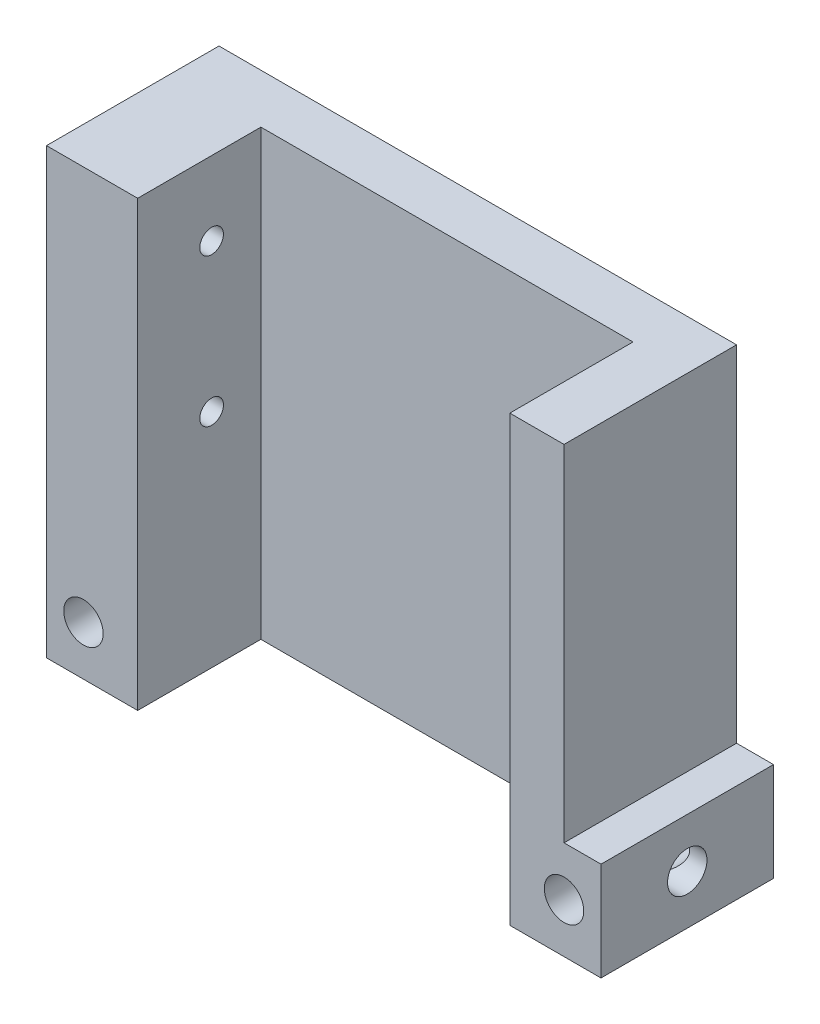
ISO-10303-21;
HEADER;
FILE_DESCRIPTION(('STEP AP214'),'2;1');
FILE_NAME('part.step','',(''),(''),'','','');
FILE_SCHEMA(('AUTOMOTIVE_DESIGN { 1 0 10303 214 1 1 1 1 }'));
ENDSEC;
DATA;
#1=APPLICATION_CONTEXT('core data for automotive mechanical design processes');
#2=APPLICATION_PROTOCOL_DEFINITION('international standard','automotive_design',2000,#1);
#3=PRODUCT_CONTEXT('',#1,'mechanical');
#4=PRODUCT('Part','Part','',(#3));
#5=PRODUCT_RELATED_PRODUCT_CATEGORY('part','',(#4));
#6=PRODUCT_DEFINITION_FORMATION('','',#4);
#7=PRODUCT_DEFINITION_CONTEXT('part definition',#1,'design');
#8=PRODUCT_DEFINITION('design','',#6,#7);
#9=PRODUCT_DEFINITION_SHAPE('','',#8);
#10=(LENGTH_UNIT() NAMED_UNIT(*) SI_UNIT(.MILLI.,.METRE.));
#11=(NAMED_UNIT(*) PLANE_ANGLE_UNIT() SI_UNIT($,.RADIAN.));
#12=(NAMED_UNIT(*) SI_UNIT($,.STERADIAN.) SOLID_ANGLE_UNIT());
#13=UNCERTAINTY_MEASURE_WITH_UNIT(LENGTH_MEASURE(1.E-05),#10,'distance_accuracy_value','');
#14=(GEOMETRIC_REPRESENTATION_CONTEXT(3) GLOBAL_UNCERTAINTY_ASSIGNED_CONTEXT((#13)) GLOBAL_UNIT_ASSIGNED_CONTEXT((#10,
#11,#12)) REPRESENTATION_CONTEXT('',''));
#15=CARTESIAN_POINT('',(0.,0.,0.));
#16=DIRECTION('',(0.,0.,1.));
#17=DIRECTION('',(1.,0.,0.));
#18=AXIS2_PLACEMENT_3D('',#15,#16,#17);
#19=CARTESIAN_POINT('',(-5.62499999999999,0.,-1.));
#20=DIRECTION('',(1.,0.,0.));
#21=DIRECTION('',(0.,1.,0.));
#22=AXIS2_PLACEMENT_3D('',#19,#20,#21);
#23=PLANE('',#22);
#24=CARTESIAN_POINT('',(-5.62499999999998,3.,1.));
#25=DIRECTION('',(-1.,0.,0.));
#26=DIRECTION('',(0.,0.,1.));
#27=AXIS2_PLACEMENT_3D('',#24,#25,#26);
#28=CIRCLE('',#27,0.24);
#29=CARTESIAN_POINT('',(-5.62499999999998,3.,1.24));
#30=VERTEX_POINT('',#29);
#31=EDGE_CURVE('E254',#30,#30,#28,.T.);
#32=ORIENTED_EDGE('',*,*,#31,.F.);
#33=EDGE_LOOP('',(#32));
#34=FACE_BOUND('',#33,.T.);
#35=CARTESIAN_POINT('',(-5.62499999999998,-3.49999999999999,0.75));
#36=DIRECTION('',(-1.,0.,0.));
#37=DIRECTION('',(0.,0.,1.));
#38=AXIS2_PLACEMENT_3D('',#35,#36,#37);
#39=CIRCLE('',#38,0.4);
#40=CARTESIAN_POINT('',(-5.62499999999998,-3.49999999999999,1.15));
#41=VERTEX_POINT('',#40);
#42=EDGE_CURVE('E136',#41,#41,#39,.T.);
#43=ORIENTED_EDGE('',*,*,#42,.F.);
#44=EDGE_LOOP('',(#43));
#45=FACE_BOUND('',#44,.T.);
#46=DIRECTION('',(0.,0.,1.));
#47=VECTOR('',#46,1.);
#48=CARTESIAN_POINT('',(-5.625,-4.5,-1.));
#49=LINE('',#48,#47);
#50=CARTESIAN_POINT('',(-5.625,-4.5,-1.));
#51=VERTEX_POINT('',#50);
#52=CARTESIAN_POINT('',(-5.625,-4.5,2.5));
#53=VERTEX_POINT('',#52);
#54=EDGE_CURVE('E214',#51,#53,#49,.T.);
#55=ORIENTED_EDGE('',*,*,#54,.T.);
#56=DIRECTION('',(0.,1.,0.));
#57=VECTOR('',#56,1.);
#58=CARTESIAN_POINT('',(-5.62499999999999,0.,2.5));
#59=LINE('',#58,#57);
#60=CARTESIAN_POINT('',(-5.62499999999999,4.5,2.5));
#61=VERTEX_POINT('',#60);
#62=EDGE_CURVE('E151',#53,#61,#59,.T.);
#63=ORIENTED_EDGE('',*,*,#62,.T.);
#64=DIRECTION('',(0.,0.,1.));
#65=VECTOR('',#64,1.);
#66=CARTESIAN_POINT('',(-5.62499999999999,4.5,-1.));
#67=LINE('',#66,#65);
#68=CARTESIAN_POINT('',(-5.62499999999999,4.5,-1.));
#69=VERTEX_POINT('',#68);
#70=EDGE_CURVE('E217',#69,#61,#67,.T.);
#71=ORIENTED_EDGE('',*,*,#70,.F.);
#72=DIRECTION('',(0.,1.,0.));
#73=VECTOR('',#72,1.);
#74=CARTESIAN_POINT('',(-5.62499999999999,0.,-1.));
#75=LINE('',#74,#73);
#76=EDGE_CURVE('E197',#51,#69,#75,.T.);
#77=ORIENTED_EDGE('',*,*,#76,.F.);
#78=EDGE_LOOP('',(#55,#63,#71,#77));
#79=FACE_BOUND('',#78,.T.);
#80=CARTESIAN_POINT('',(-5.62499999999999,0.,1.));
#81=DIRECTION('',(-1.,0.,0.));
#82=DIRECTION('',(0.,0.,1.));
#83=AXIS2_PLACEMENT_3D('',#80,#81,#82);
#84=CIRCLE('',#83,0.24);
#85=CARTESIAN_POINT('',(-5.62499999999999,0.,1.24));
#86=VERTEX_POINT('',#85);
#87=EDGE_CURVE('E246',#86,#86,#84,.T.);
#88=ORIENTED_EDGE('',*,*,#87,.F.);
#89=EDGE_LOOP('',(#88));
#90=FACE_BOUND('',#89,.T.);
#91=ADVANCED_FACE('F36',(#34,#45,#79,#90),#23,.F.);
#92=CARTESIAN_POINT('',(0.,4.5,-1.));
#93=DIRECTION('',(0.,-1.,0.));
#94=DIRECTION('',(0.,0.,-1.));
#95=AXIS2_PLACEMENT_3D('',#92,#93,#94);
#96=PLANE('',#95);
#97=ORIENTED_EDGE('',*,*,#70,.T.);
#98=DIRECTION('',(1.,0.,0.));
#99=VECTOR('',#98,1.);
#100=CARTESIAN_POINT('',(0.,4.5,2.5));
#101=LINE('',#100,#99);
#102=CARTESIAN_POINT('',(-3.775,4.5,2.5));
#103=VERTEX_POINT('',#102);
#104=EDGE_CURVE('E159',#61,#103,#101,.T.);
#105=ORIENTED_EDGE('',*,*,#104,.T.);
#106=DIRECTION('',(0.,0.,-1.));
#107=VECTOR('',#106,1.);
#108=CARTESIAN_POINT('',(-3.775,4.5,2.5));
#109=LINE('',#108,#107);
#110=CARTESIAN_POINT('',(-3.775,4.5,0.));
#111=VERTEX_POINT('',#110);
#112=EDGE_CURVE('E162',#103,#111,#109,.T.);
#113=ORIENTED_EDGE('',*,*,#112,.T.);
#114=DIRECTION('',(1.,0.,0.));
#115=VECTOR('',#114,1.);
#116=CARTESIAN_POINT('',(0.,4.5,0.));
#117=LINE('',#116,#115);
#118=CARTESIAN_POINT('',(3.775,4.5,0.));
#119=VERTEX_POINT('',#118);
#120=EDGE_CURVE('E201',#111,#119,#117,.T.);
#121=ORIENTED_EDGE('',*,*,#120,.T.);
#122=DIRECTION('',(0.,0.,-1.));
#123=VECTOR('',#122,1.);
#124=CARTESIAN_POINT('',(3.775,4.5,2.5));
#125=LINE('',#124,#123);
#126=CARTESIAN_POINT('',(3.775,4.5,2.5));
#127=VERTEX_POINT('',#126);
#128=EDGE_CURVE('E188',#127,#119,#125,.T.);
#129=ORIENTED_EDGE('',*,*,#128,.F.);
#130=DIRECTION('',(1.,0.,0.));
#131=VECTOR('',#130,1.);
#132=CARTESIAN_POINT('',(0.,4.5,2.5));
#133=LINE('',#132,#131);
#134=CARTESIAN_POINT('',(4.875,4.5,2.5));
#135=VERTEX_POINT('',#134);
#136=EDGE_CURVE('E185',#127,#135,#133,.T.);
#137=ORIENTED_EDGE('',*,*,#136,.T.);
#138=DIRECTION('',(0.,0.,1.));
#139=VECTOR('',#138,1.);
#140=CARTESIAN_POINT('',(4.875,4.5,-1.));
#141=LINE('',#140,#139);
#142=CARTESIAN_POINT('',(4.875,4.5,-1.));
#143=VERTEX_POINT('',#142);
#144=EDGE_CURVE('E220',#143,#135,#141,.T.);
#145=ORIENTED_EDGE('',*,*,#144,.F.);
#146=DIRECTION('',(1.,0.,0.));
#147=VECTOR('',#146,1.);
#148=CARTESIAN_POINT('',(0.,4.5,-1.));
#149=LINE('',#148,#147);
#150=EDGE_CURVE('E212',#69,#143,#149,.T.);
#151=ORIENTED_EDGE('',*,*,#150,.F.);
#152=EDGE_LOOP('',(#97,#105,#113,#121,#129,#137,#145,#151));
#153=FACE_BOUND('',#152,.T.);
#154=ADVANCED_FACE('F239',(#153),#96,.F.);
#155=CARTESIAN_POINT('',(4.875,0.,-1.));
#156=DIRECTION('',(-1.,0.,0.));
#157=DIRECTION('',(0.,-1.,0.));
#158=AXIS2_PLACEMENT_3D('',#155,#156,#157);
#159=PLANE('',#158);
#160=ORIENTED_EDGE('',*,*,#144,.T.);
#161=DIRECTION('',(0.,-1.,0.));
#162=VECTOR('',#161,1.);
#163=CARTESIAN_POINT('',(4.875,0.,2.5));
#164=LINE('',#163,#162);
#165=CARTESIAN_POINT('',(4.875,-2.5,2.5));
#166=VERTEX_POINT('',#165);
#167=EDGE_CURVE('E182',#135,#166,#164,.T.);
#168=ORIENTED_EDGE('',*,*,#167,.T.);
#169=DIRECTION('',(0.,0.,1.));
#170=VECTOR('',#169,1.);
#171=CARTESIAN_POINT('',(4.875,-2.5,-1.));
#172=LINE('',#171,#170);
#173=CARTESIAN_POINT('',(4.875,-2.5,-1.));
#174=VERTEX_POINT('',#173);
#175=EDGE_CURVE('E222',#174,#166,#172,.T.);
#176=ORIENTED_EDGE('',*,*,#175,.F.);
#177=DIRECTION('',(0.,-1.,0.));
#178=VECTOR('',#177,1.);
#179=CARTESIAN_POINT('',(4.875,0.,-1.));
#180=LINE('',#179,#178);
#181=EDGE_CURVE('E210',#143,#174,#180,.T.);
#182=ORIENTED_EDGE('',*,*,#181,.F.);
#183=EDGE_LOOP('',(#160,#168,#176,#182));
#184=FACE_BOUND('',#183,.T.);
#185=ADVANCED_FACE('F277',(#184),#159,.F.);
#186=CARTESIAN_POINT('',(0.,-2.49999999999999,-1.));
#187=DIRECTION('',(0.,1.,0.));
#188=DIRECTION('',(-1.,0.,0.));
#189=AXIS2_PLACEMENT_3D('',#186,#187,#188);
#190=PLANE('',#189);
#191=ORIENTED_EDGE('',*,*,#175,.T.);
#192=DIRECTION('',(-1.,0.,0.));
#193=VECTOR('',#192,1.);
#194=CARTESIAN_POINT('',(0.,-2.49999999999999,2.5));
#195=LINE('',#194,#193);
#196=CARTESIAN_POINT('',(5.62499999999999,-2.5,2.5));
#197=VERTEX_POINT('',#196);
#198=EDGE_CURVE('E179',#197,#166,#195,.T.);
#199=ORIENTED_EDGE('',*,*,#198,.F.);
#200=DIRECTION('',(0.,0.,1.));
#201=VECTOR('',#200,1.);
#202=CARTESIAN_POINT('',(5.62499999999999,-2.5,-1.));
#203=LINE('',#202,#201);
#204=CARTESIAN_POINT('',(5.62499999999999,-2.5,-1.));
#205=VERTEX_POINT('',#204);
#206=EDGE_CURVE('E224',#205,#197,#203,.T.);
#207=ORIENTED_EDGE('',*,*,#206,.F.);
#208=DIRECTION('',(-1.,0.,0.));
#209=VECTOR('',#208,1.);
#210=CARTESIAN_POINT('',(0.,-2.49999999999999,-1.));
#211=LINE('',#210,#209);
#212=EDGE_CURVE('E207',#205,#174,#211,.T.);
#213=ORIENTED_EDGE('',*,*,#212,.T.);
#214=EDGE_LOOP('',(#191,#199,#207,#213));
#215=FACE_BOUND('',#214,.T.);
#216=ADVANCED_FACE('F264',(#215),#190,.T.);
#217=CARTESIAN_POINT('',(5.62499999999998,0.,-1.));
#218=DIRECTION('',(1.,0.,0.));
#219=DIRECTION('',(0.,1.,0.));
#220=AXIS2_PLACEMENT_3D('',#217,#218,#219);
#221=PLANE('',#220);
#222=CARTESIAN_POINT('',(5.62499999999998,-3.49999999999999,0.75));
#223=DIRECTION('',(1.,0.,0.));
#224=DIRECTION('',(0.,0.,-1.));
#225=AXIS2_PLACEMENT_3D('',#222,#223,#224);
#226=CIRCLE('',#225,0.4);
#227=CARTESIAN_POINT('',(5.62499999999998,-3.49999999999999,0.35));
#228=VERTEX_POINT('',#227);
#229=EDGE_CURVE('E141',#228,#228,#226,.T.);
#230=ORIENTED_EDGE('',*,*,#229,.F.);
#231=EDGE_LOOP('',(#230));
#232=FACE_BOUND('',#231,.T.);
#233=ORIENTED_EDGE('',*,*,#206,.T.);
#234=DIRECTION('',(0.,1.,0.));
#235=VECTOR('',#234,1.);
#236=CARTESIAN_POINT('',(5.62499999999998,0.,2.5));
#237=LINE('',#236,#235);
#238=CARTESIAN_POINT('',(5.62499999999999,-4.5,2.5));
#239=VERTEX_POINT('',#238);
#240=EDGE_CURVE('E176',#239,#197,#237,.T.);
#241=ORIENTED_EDGE('',*,*,#240,.F.);
#242=DIRECTION('',(0.,0.,1.));
#243=VECTOR('',#242,1.);
#244=CARTESIAN_POINT('',(5.62499999999999,-4.5,-1.));
#245=LINE('',#244,#243);
#246=CARTESIAN_POINT('',(5.62499999999999,-4.5,-1.));
#247=VERTEX_POINT('',#246);
#248=EDGE_CURVE('E226',#247,#239,#245,.T.);
#249=ORIENTED_EDGE('',*,*,#248,.F.);
#250=DIRECTION('',(0.,1.,0.));
#251=VECTOR('',#250,1.);
#252=CARTESIAN_POINT('',(5.62499999999998,0.,-1.));
#253=LINE('',#252,#251);
#254=EDGE_CURVE('E204',#247,#205,#253,.T.);
#255=ORIENTED_EDGE('',*,*,#254,.T.);
#256=EDGE_LOOP('',(#233,#241,#249,#255));
#257=FACE_BOUND('',#256,.T.);
#258=ADVANCED_FACE('F260',(#232,#257),#221,.T.);
#259=CARTESIAN_POINT('',(0.,-4.5,-1.));
#260=DIRECTION('',(0.,-1.,0.));
#261=DIRECTION('',(0.,0.,-1.));
#262=AXIS2_PLACEMENT_3D('',#259,#260,#261);
#263=PLANE('',#262);
#264=DIRECTION('',(1.,0.,0.));
#265=VECTOR('',#264,1.);
#266=CARTESIAN_POINT('',(0.,-4.5,0.));
#267=LINE('',#266,#265);
#268=CARTESIAN_POINT('',(-3.775,-4.5,0.));
#269=VERTEX_POINT('',#268);
#270=CARTESIAN_POINT('',(3.775,-4.5,0.));
#271=VERTEX_POINT('',#270);
#272=EDGE_CURVE('E196',#269,#271,#267,.T.);
#273=ORIENTED_EDGE('',*,*,#272,.F.);
#274=DIRECTION('',(0.,0.,-1.));
#275=VECTOR('',#274,1.);
#276=CARTESIAN_POINT('',(-3.775,-4.5,2.5));
#277=LINE('',#276,#275);
#278=CARTESIAN_POINT('',(-3.775,-4.5,2.5));
#279=VERTEX_POINT('',#278);
#280=EDGE_CURVE('E167',#279,#269,#277,.T.);
#281=ORIENTED_EDGE('',*,*,#280,.F.);
#282=DIRECTION('',(1.,0.,0.));
#283=VECTOR('',#282,1.);
#284=CARTESIAN_POINT('',(0.,-4.5,2.5));
#285=LINE('',#284,#283);
#286=EDGE_CURVE('E154',#53,#279,#285,.T.);
#287=ORIENTED_EDGE('',*,*,#286,.F.);
#288=ORIENTED_EDGE('',*,*,#54,.F.);
#289=DIRECTION('',(1.,0.,0.));
#290=VECTOR('',#289,1.);
#291=CARTESIAN_POINT('',(0.,-4.5,-1.));
#292=LINE('',#291,#290);
#293=EDGE_CURVE('E200',#51,#247,#292,.T.);
#294=ORIENTED_EDGE('',*,*,#293,.T.);
#295=ORIENTED_EDGE('',*,*,#248,.T.);
#296=DIRECTION('',(1.,0.,0.));
#297=VECTOR('',#296,1.);
#298=CARTESIAN_POINT('',(0.,-4.49999999999999,2.5));
#299=LINE('',#298,#297);
#300=CARTESIAN_POINT('',(3.775,-4.5,2.5));
#301=VERTEX_POINT('',#300);
#302=EDGE_CURVE('E173',#301,#239,#299,.T.);
#303=ORIENTED_EDGE('',*,*,#302,.F.);
#304=DIRECTION('',(0.,0.,-1.));
#305=VECTOR('',#304,1.);
#306=CARTESIAN_POINT('',(3.775,-4.5,2.5));
#307=LINE('',#306,#305);
#308=EDGE_CURVE('E193',#301,#271,#307,.T.);
#309=ORIENTED_EDGE('',*,*,#308,.T.);
#310=EDGE_LOOP('',(#273,#281,#287,#288,#294,#295,#303,#309));
#311=FACE_BOUND('',#310,.T.);
#312=ADVANCED_FACE('F263',(#311),#263,.T.);
#313=CARTESIAN_POINT('',(0.,0.,-1.));
#314=DIRECTION('',(0.,0.,1.));
#315=DIRECTION('',(1.,0.,0.));
#316=AXIS2_PLACEMENT_3D('',#313,#314,#315);
#317=PLANE('',#316);
#318=CARTESIAN_POINT('',(4.875,-3.5,-1.));
#319=DIRECTION('',(0.,0.,1.));
#320=DIRECTION('',(1.,0.,0.));
#321=AXIS2_PLACEMENT_3D('',#318,#319,#320);
#322=CIRCLE('',#321,0.399999999999999);
#323=CARTESIAN_POINT('',(5.275,-3.5,-1.));
#324=VERTEX_POINT('',#323);
#325=EDGE_CURVE('E131',#324,#324,#322,.T.);
#326=ORIENTED_EDGE('',*,*,#325,.T.);
#327=EDGE_LOOP('',(#326));
#328=FACE_BOUND('',#327,.T.);
#329=CARTESIAN_POINT('',(-4.875,-3.5,-1.));
#330=DIRECTION('',(0.,0.,1.));
#331=DIRECTION('',(1.,0.,0.));
#332=AXIS2_PLACEMENT_3D('',#329,#330,#331);
#333=CIRCLE('',#332,0.399999999999999);
#334=CARTESIAN_POINT('',(-4.475,-3.5,-1.));
#335=VERTEX_POINT('',#334);
#336=EDGE_CURVE('E147',#335,#335,#333,.T.);
#337=ORIENTED_EDGE('',*,*,#336,.T.);
#338=EDGE_LOOP('',(#337));
#339=FACE_BOUND('',#338,.T.);
#340=ORIENTED_EDGE('',*,*,#76,.T.);
#341=ORIENTED_EDGE('',*,*,#150,.T.);
#342=ORIENTED_EDGE('',*,*,#181,.T.);
#343=ORIENTED_EDGE('',*,*,#212,.F.);
#344=ORIENTED_EDGE('',*,*,#254,.F.);
#345=ORIENTED_EDGE('',*,*,#293,.F.);
#346=EDGE_LOOP('',(#340,#341,#342,#343,#344,#345));
#347=FACE_BOUND('',#346,.T.);
#348=ADVANCED_FACE('F292',(#328,#339,#347),#317,.F.);
#349=CARTESIAN_POINT('',(0.,0.,0.));
#350=DIRECTION('',(0.,0.,1.));
#351=DIRECTION('',(1.,0.,0.));
#352=AXIS2_PLACEMENT_3D('',#349,#350,#351);
#353=PLANE('',#352);
#354=DIRECTION('',(0.,-1.,0.));
#355=VECTOR('',#354,1.);
#356=CARTESIAN_POINT('',(-3.775,0.,0.));
#357=LINE('',#356,#355);
#358=EDGE_CURVE('E150',#111,#269,#357,.T.);
#359=ORIENTED_EDGE('',*,*,#358,.T.);
#360=ORIENTED_EDGE('',*,*,#272,.T.);
#361=DIRECTION('',(0.,-1.,0.));
#362=VECTOR('',#361,1.);
#363=CARTESIAN_POINT('',(3.775,0.,0.));
#364=LINE('',#363,#362);
#365=EDGE_CURVE('E169',#119,#271,#364,.T.);
#366=ORIENTED_EDGE('',*,*,#365,.F.);
#367=ORIENTED_EDGE('',*,*,#120,.F.);
#368=EDGE_LOOP('',(#359,#360,#366,#367));
#369=FACE_BOUND('',#368,.T.);
#370=ADVANCED_FACE('F302',(#369),#353,.T.);
#371=CARTESIAN_POINT('',(3.775,0.,2.5));
#372=DIRECTION('',(1.,0.,0.));
#373=DIRECTION('',(0.,1.,0.));
#374=AXIS2_PLACEMENT_3D('',#371,#372,#373);
#375=PLANE('',#374);
#376=ORIENTED_EDGE('',*,*,#365,.T.);
#377=ORIENTED_EDGE('',*,*,#308,.F.);
#378=DIRECTION('',(0.,-1.,0.));
#379=VECTOR('',#378,1.);
#380=CARTESIAN_POINT('',(3.775,0.,2.5));
#381=LINE('',#380,#379);
#382=EDGE_CURVE('E170',#127,#301,#381,.T.);
#383=ORIENTED_EDGE('',*,*,#382,.F.);
#384=ORIENTED_EDGE('',*,*,#128,.T.);
#385=EDGE_LOOP('',(#376,#377,#383,#384));
#386=FACE_BOUND('',#385,.T.);
#387=ADVANCED_FACE('F286',(#386),#375,.F.);
#388=CARTESIAN_POINT('',(0.,0.,2.5));
#389=DIRECTION('',(0.,0.,1.));
#390=DIRECTION('',(1.,0.,0.));
#391=AXIS2_PLACEMENT_3D('',#388,#389,#390);
#392=PLANE('',#391);
#393=CARTESIAN_POINT('',(4.875,-3.5,2.5));
#394=DIRECTION('',(0.,0.,1.));
#395=DIRECTION('',(1.,0.,0.));
#396=AXIS2_PLACEMENT_3D('',#393,#394,#395);
#397=CIRCLE('',#396,0.399999999999999);
#398=CARTESIAN_POINT('',(5.275,-3.5,2.5));
#399=VERTEX_POINT('',#398);
#400=EDGE_CURVE('E134',#399,#399,#397,.T.);
#401=ORIENTED_EDGE('',*,*,#400,.F.);
#402=EDGE_LOOP('',(#401));
#403=FACE_BOUND('',#402,.T.);
#404=ORIENTED_EDGE('',*,*,#382,.T.);
#405=ORIENTED_EDGE('',*,*,#302,.T.);
#406=ORIENTED_EDGE('',*,*,#240,.T.);
#407=ORIENTED_EDGE('',*,*,#198,.T.);
#408=ORIENTED_EDGE('',*,*,#167,.F.);
#409=ORIENTED_EDGE('',*,*,#136,.F.);
#410=EDGE_LOOP('',(#404,#405,#406,#407,#408,#409));
#411=FACE_BOUND('',#410,.T.);
#412=ADVANCED_FACE('F272',(#403,#411),#392,.T.);
#413=CARTESIAN_POINT('',(-3.775,0.,2.5));
#414=DIRECTION('',(1.,0.,0.));
#415=DIRECTION('',(0.,1.,0.));
#416=AXIS2_PLACEMENT_3D('',#413,#414,#415);
#417=PLANE('',#416);
#418=CARTESIAN_POINT('',(-3.775,3.,1.));
#419=DIRECTION('',(1.,0.,0.));
#420=DIRECTION('',(0.,1.,0.));
#421=AXIS2_PLACEMENT_3D('',#418,#419,#420);
#422=CIRCLE('',#421,0.239999999999999);
#423=CARTESIAN_POINT('',(-3.775,3.24,1.));
#424=VERTEX_POINT('',#423);
#425=EDGE_CURVE('E249',#424,#424,#422,.T.);
#426=ORIENTED_EDGE('',*,*,#425,.F.);
#427=EDGE_LOOP('',(#426));
#428=FACE_BOUND('',#427,.T.);
#429=CARTESIAN_POINT('',(-3.775,0.,1.));
#430=DIRECTION('',(1.,0.,0.));
#431=DIRECTION('',(0.,1.,0.));
#432=AXIS2_PLACEMENT_3D('',#429,#430,#431);
#433=CIRCLE('',#432,0.239999999999999);
#434=CARTESIAN_POINT('',(-3.775,0.240000000000011,1.));
#435=VERTEX_POINT('',#434);
#436=EDGE_CURVE('E248',#435,#435,#433,.T.);
#437=ORIENTED_EDGE('',*,*,#436,.F.);
#438=EDGE_LOOP('',(#437));
#439=FACE_BOUND('',#438,.T.);
#440=ORIENTED_EDGE('',*,*,#358,.F.);
#441=ORIENTED_EDGE('',*,*,#112,.F.);
#442=DIRECTION('',(0.,-1.,0.));
#443=VECTOR('',#442,1.);
#444=CARTESIAN_POINT('',(-3.775,0.,2.5));
#445=LINE('',#444,#443);
#446=EDGE_CURVE('E156',#103,#279,#445,.T.);
#447=ORIENTED_EDGE('',*,*,#446,.T.);
#448=ORIENTED_EDGE('',*,*,#280,.T.);
#449=EDGE_LOOP('',(#440,#441,#447,#448));
#450=FACE_BOUND('',#449,.T.);
#451=ADVANCED_FACE('F300',(#428,#439,#450),#417,.T.);
#452=CARTESIAN_POINT('',(0.,0.,2.5));
#453=DIRECTION('',(0.,0.,1.));
#454=DIRECTION('',(1.,0.,0.));
#455=AXIS2_PLACEMENT_3D('',#452,#453,#454);
#456=PLANE('',#455);
#457=CARTESIAN_POINT('',(-4.875,-3.5,2.5));
#458=DIRECTION('',(0.,0.,1.));
#459=DIRECTION('',(1.,0.,0.));
#460=AXIS2_PLACEMENT_3D('',#457,#458,#459);
#461=CIRCLE('',#460,0.399999999999999);
#462=CARTESIAN_POINT('',(-4.475,-3.5,2.5));
#463=VERTEX_POINT('',#462);
#464=EDGE_CURVE('E138',#463,#463,#461,.T.);
#465=ORIENTED_EDGE('',*,*,#464,.F.);
#466=EDGE_LOOP('',(#465));
#467=FACE_BOUND('',#466,.T.);
#468=ORIENTED_EDGE('',*,*,#62,.F.);
#469=ORIENTED_EDGE('',*,*,#286,.T.);
#470=ORIENTED_EDGE('',*,*,#446,.F.);
#471=ORIENTED_EDGE('',*,*,#104,.F.);
#472=EDGE_LOOP('',(#468,#469,#470,#471));
#473=FACE_BOUND('',#472,.T.);
#474=ADVANCED_FACE('F298',(#467,#473),#456,.T.);
#475=CARTESIAN_POINT('',(-4.875,-3.5,2.5));
#476=DIRECTION('',(0.,0.,1.));
#477=DIRECTION('',(1.,0.,0.));
#478=AXIS2_PLACEMENT_3D('',#475,#476,#477);
#479=CYLINDRICAL_SURFACE('',#478,0.399999999999999);
#480=CARTESIAN_POINT('',(-4.875,-3.49999999999999,0.75));
#481=DIRECTION('',(0.707106781186547,0.,0.707106781186547));
#482=DIRECTION('',(-0.707106781186547,0.,0.707106781186547));
#483=AXIS2_PLACEMENT_3D('',#480,#481,#482);
#484=ELLIPSE('',#483,0.565685424949237,0.399999999999999);
#485=CARTESIAN_POINT('',(-4.875,-3.89999999999999,0.75));
#486=VERTEX_POINT('',#485);
#487=CARTESIAN_POINT('',(-4.875,-3.09999999999999,0.75));
#488=VERTEX_POINT('',#487);
#489=EDGE_CURVE('E219',#486,#488,#484,.F.);
#490=ORIENTED_EDGE('',*,*,#489,.T.);
#491=CARTESIAN_POINT('',(-4.875,-3.49999999999999,0.75));
#492=DIRECTION('',(-0.707106781186547,0.,0.707106781186547));
#493=DIRECTION('',(0.707106781186547,0.,0.707106781186547));
#494=AXIS2_PLACEMENT_3D('',#491,#492,#493);
#495=ELLIPSE('',#494,0.565685424949237,0.399999999999999);
#496=EDGE_CURVE('E54',#488,#486,#495,.T.);
#497=ORIENTED_EDGE('',*,*,#496,.T.);
#498=EDGE_LOOP('',(#490,#497));
#499=FACE_BOUND('',#498,.T.);
#500=ORIENTED_EDGE('',*,*,#336,.F.);
#501=EDGE_LOOP('',(#500));
#502=FACE_BOUND('',#501,.T.);
#503=ORIENTED_EDGE('',*,*,#464,.T.);
#504=EDGE_LOOP('',(#503));
#505=FACE_BOUND('',#504,.T.);
#506=ADVANCED_FACE('F126',(#499,#502,#505),#479,.F.);
#507=CARTESIAN_POINT('',(4.875,-3.5,2.5));
#508=DIRECTION('',(0.,0.,1.));
#509=DIRECTION('',(1.,0.,0.));
#510=AXIS2_PLACEMENT_3D('',#507,#508,#509);
#511=CYLINDRICAL_SURFACE('',#510,0.399999999999999);
#512=CARTESIAN_POINT('',(4.875,-3.49999999999999,0.75));
#513=DIRECTION('',(-0.707106781186547,0.,0.707106781186547));
#514=DIRECTION('',(0.707106781186547,0.,0.707106781186547));
#515=AXIS2_PLACEMENT_3D('',#512,#513,#514);
#516=ELLIPSE('',#515,0.565685424949237,0.4);
#517=CARTESIAN_POINT('',(4.875,-3.09999999999999,0.75));
#518=VERTEX_POINT('',#517);
#519=CARTESIAN_POINT('',(4.875,-3.89999999999999,0.75));
#520=VERTEX_POINT('',#519);
#521=EDGE_CURVE('E43',#518,#520,#516,.F.);
#522=ORIENTED_EDGE('',*,*,#521,.T.);
#523=CARTESIAN_POINT('',(4.875,-3.49999999999999,0.75));
#524=DIRECTION('',(0.707106781186547,0.,0.707106781186547));
#525=DIRECTION('',(-0.707106781186547,0.,0.707106781186547));
#526=AXIS2_PLACEMENT_3D('',#523,#524,#525);
#527=ELLIPSE('',#526,0.565685424949237,0.4);
#528=EDGE_CURVE('E11',#520,#518,#527,.T.);
#529=ORIENTED_EDGE('',*,*,#528,.T.);
#530=EDGE_LOOP('',(#522,#529));
#531=FACE_BOUND('',#530,.T.);
#532=ORIENTED_EDGE('',*,*,#325,.F.);
#533=EDGE_LOOP('',(#532));
#534=FACE_BOUND('',#533,.T.);
#535=ORIENTED_EDGE('',*,*,#400,.T.);
#536=EDGE_LOOP('',(#535));
#537=FACE_BOUND('',#536,.T.);
#538=ADVANCED_FACE('F122',(#531,#534,#537),#511,.F.);
#539=CARTESIAN_POINT('',(-5.62499999999998,-3.49999999999999,0.75));
#540=DIRECTION('',(-1.,0.,0.));
#541=DIRECTION('',(0.,0.,1.));
#542=AXIS2_PLACEMENT_3D('',#539,#540,#541);
#543=CYLINDRICAL_SURFACE('',#542,0.399999999999999);
#544=ORIENTED_EDGE('',*,*,#489,.F.);
#545=ORIENTED_EDGE('',*,*,#496,.F.);
#546=EDGE_LOOP('',(#544,#545));
#547=FACE_BOUND('',#546,.T.);
#548=ORIENTED_EDGE('',*,*,#42,.T.);
#549=EDGE_LOOP('',(#548));
#550=FACE_BOUND('',#549,.T.);
#551=ADVANCED_FACE('F125',(#547,#550),#543,.F.);
#552=CARTESIAN_POINT('',(5.62499999999998,-3.49999999999999,0.75));
#553=DIRECTION('',(1.,0.,0.));
#554=DIRECTION('',(0.,0.,-1.));
#555=AXIS2_PLACEMENT_3D('',#552,#553,#554);
#556=CYLINDRICAL_SURFACE('',#555,0.4);
#557=ORIENTED_EDGE('',*,*,#521,.F.);
#558=ORIENTED_EDGE('',*,*,#528,.F.);
#559=EDGE_LOOP('',(#557,#558));
#560=FACE_BOUND('',#559,.T.);
#561=ORIENTED_EDGE('',*,*,#229,.T.);
#562=EDGE_LOOP('',(#561));
#563=FACE_BOUND('',#562,.T.);
#564=ADVANCED_FACE('F119',(#560,#563),#556,.F.);
#565=CARTESIAN_POINT('',(-5.62499999999999,0.,1.));
#566=DIRECTION('',(-1.,0.,0.));
#567=DIRECTION('',(0.,0.,1.));
#568=AXIS2_PLACEMENT_3D('',#565,#566,#567);
#569=CYLINDRICAL_SURFACE('',#568,0.239999999999999);
#570=ORIENTED_EDGE('',*,*,#87,.T.);
#571=EDGE_LOOP('',(#570));
#572=FACE_BOUND('',#571,.T.);
#573=ORIENTED_EDGE('',*,*,#436,.T.);
#574=EDGE_LOOP('',(#573));
#575=FACE_BOUND('',#574,.T.);
#576=ADVANCED_FACE('F382',(#572,#575),#569,.F.);
#577=CARTESIAN_POINT('',(-5.62499999999998,3.,1.));
#578=DIRECTION('',(-1.,0.,0.));
#579=DIRECTION('',(0.,0.,1.));
#580=AXIS2_PLACEMENT_3D('',#577,#578,#579);
#581=CYLINDRICAL_SURFACE('',#580,0.239999999999999);
#582=ORIENTED_EDGE('',*,*,#31,.T.);
#583=EDGE_LOOP('',(#582));
#584=FACE_BOUND('',#583,.T.);
#585=ORIENTED_EDGE('',*,*,#425,.T.);
#586=EDGE_LOOP('',(#585));
#587=FACE_BOUND('',#586,.T.);
#588=ADVANCED_FACE('F408',(#584,#587),#581,.F.);
#589=CLOSED_SHELL('',(#91,#154,#185,#216,#258,#312,#348,#370,#387,#412,#451,#474,#506,#538,#551,
#564,#576,#588));
#590=MANIFOLD_SOLID_BREP('B2',#589);
#591=ADVANCED_BREP_SHAPE_REPRESENTATION('',(#18,#590),#14);
#592=SHAPE_DEFINITION_REPRESENTATION(#9,#591);
ENDSEC;
END-ISO-10303-21;
